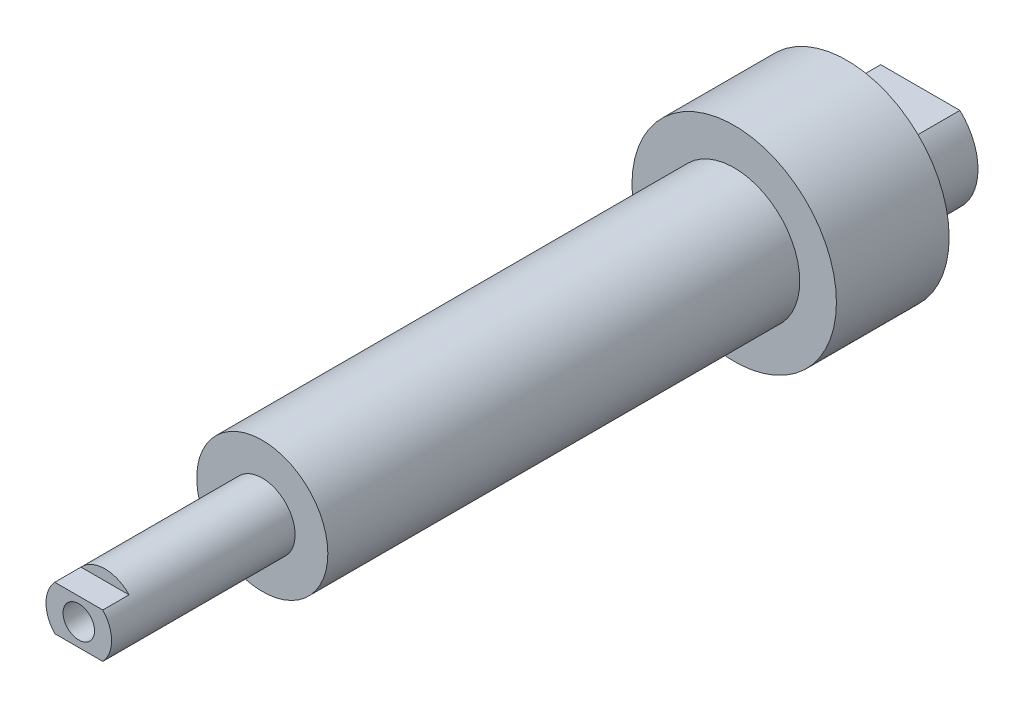
ISO-10303-21;
HEADER;
FILE_DESCRIPTION(('STEP AP214'),'2;1');
FILE_NAME('part.step','',(''),(''),'','','');
FILE_SCHEMA(('AUTOMOTIVE_DESIGN { 1 0 10303 214 1 1 1 1 }'));
ENDSEC;
DATA;
#1=APPLICATION_CONTEXT('core data for automotive mechanical design processes');
#2=APPLICATION_PROTOCOL_DEFINITION('international standard','automotive_design',2000,#1);
#3=PRODUCT_CONTEXT('',#1,'mechanical');
#4=PRODUCT('Part','Part','',(#3));
#5=PRODUCT_RELATED_PRODUCT_CATEGORY('part','',(#4));
#6=PRODUCT_DEFINITION_FORMATION('','',#4);
#7=PRODUCT_DEFINITION_CONTEXT('part definition',#1,'design');
#8=PRODUCT_DEFINITION('design','',#6,#7);
#9=PRODUCT_DEFINITION_SHAPE('','',#8);
#10=(LENGTH_UNIT() NAMED_UNIT(*) SI_UNIT(.MILLI.,.METRE.));
#11=(NAMED_UNIT(*) PLANE_ANGLE_UNIT() SI_UNIT($,.RADIAN.));
#12=(NAMED_UNIT(*) SI_UNIT($,.STERADIAN.) SOLID_ANGLE_UNIT());
#13=UNCERTAINTY_MEASURE_WITH_UNIT(LENGTH_MEASURE(1.E-05),#10,'distance_accuracy_value','');
#14=(GEOMETRIC_REPRESENTATION_CONTEXT(3) GLOBAL_UNCERTAINTY_ASSIGNED_CONTEXT((#13)) GLOBAL_UNIT_ASSIGNED_CONTEXT((#10,
#11,#12)) REPRESENTATION_CONTEXT('',''));
#15=CARTESIAN_POINT('',(0.,0.,0.));
#16=DIRECTION('',(0.,0.,1.));
#17=DIRECTION('',(1.,0.,0.));
#18=AXIS2_PLACEMENT_3D('',#15,#16,#17);
#19=CARTESIAN_POINT('',(0.,0.,251.));
#20=DIRECTION('',(0.,0.,1.));
#21=DIRECTION('',(1.,0.,0.));
#22=AXIS2_PLACEMENT_3D('',#19,#20,#21);
#23=CYLINDRICAL_SURFACE('',#22,12.5);
#24=DIRECTION('',(0.,0.,-1.));
#25=VECTOR('',#24,1.);
#26=CARTESIAN_POINT('',(-9.16515138991168,-8.5,832.780641203438));
#27=LINE('',#26,#25);
#28=CARTESIAN_POINT('',(-9.16515138991168,-8.5,321.));
#29=VERTEX_POINT('',#28);
#30=CARTESIAN_POINT('',(-9.16515138991168,-8.5,311.));
#31=VERTEX_POINT('',#30);
#32=EDGE_CURVE('E121',#29,#31,#27,.T.);
#33=ORIENTED_EDGE('',*,*,#32,.F.);
#34=CARTESIAN_POINT('',(0.,0.,321.));
#35=DIRECTION('',(0.,0.,1.));
#36=DIRECTION('',(1.,0.,0.));
#37=AXIS2_PLACEMENT_3D('',#34,#35,#36);
#38=CIRCLE('',#37,12.5);
#39=CARTESIAN_POINT('',(-9.16515138991168,8.5,321.));
#40=VERTEX_POINT('',#39);
#41=EDGE_CURVE('E110',#40,#29,#38,.T.);
#42=ORIENTED_EDGE('',*,*,#41,.F.);
#43=DIRECTION('',(0.,0.,-1.));
#44=VECTOR('',#43,1.);
#45=CARTESIAN_POINT('',(-9.16515138991168,8.5,1057.78064120344));
#46=LINE('',#45,#44);
#47=CARTESIAN_POINT('',(-9.16515138991168,8.5,311.));
#48=VERTEX_POINT('',#47);
#49=EDGE_CURVE('E139',#40,#48,#46,.T.);
#50=ORIENTED_EDGE('',*,*,#49,.T.);
#51=CARTESIAN_POINT('',(0.,0.,311.));
#52=DIRECTION('',(0.,0.,1.));
#53=DIRECTION('',(1.,0.,0.));
#54=AXIS2_PLACEMENT_3D('',#51,#52,#53);
#55=CIRCLE('',#54,12.5);
#56=CARTESIAN_POINT('',(9.16515138991168,8.5,311.));
#57=VERTEX_POINT('',#56);
#58=EDGE_CURVE('E127',#57,#48,#55,.T.);
#59=ORIENTED_EDGE('',*,*,#58,.F.);
#60=DIRECTION('',(0.,0.,-1.));
#61=VECTOR('',#60,1.);
#62=CARTESIAN_POINT('',(9.16515138991168,8.5,1057.78064120344));
#63=LINE('',#62,#61);
#64=CARTESIAN_POINT('',(9.16515138991168,8.5,321.));
#65=VERTEX_POINT('',#64);
#66=EDGE_CURVE('E136',#65,#57,#63,.T.);
#67=ORIENTED_EDGE('',*,*,#66,.F.);
#68=CARTESIAN_POINT('',(9.16515138991168,-8.5,321.));
#69=VERTEX_POINT('',#68);
#70=EDGE_CURVE('E118',#69,#65,#38,.T.);
#71=ORIENTED_EDGE('',*,*,#70,.F.);
#72=DIRECTION('',(0.,0.,-1.));
#73=VECTOR('',#72,1.);
#74=CARTESIAN_POINT('',(9.16515138991168,-8.5,832.780641203438));
#75=LINE('',#74,#73);
#76=CARTESIAN_POINT('',(9.16515138991168,-8.5,311.));
#77=VERTEX_POINT('',#76);
#78=EDGE_CURVE('E65',#69,#77,#75,.T.);
#79=ORIENTED_EDGE('',*,*,#78,.T.);
#80=CARTESIAN_POINT('',(0.,0.,311.));
#81=DIRECTION('',(0.,0.,1.));
#82=DIRECTION('',(1.,0.,0.));
#83=AXIS2_PLACEMENT_3D('',#80,#81,#82);
#84=CIRCLE('',#83,12.5);
#85=EDGE_CURVE('E60',#31,#77,#84,.T.);
#86=ORIENTED_EDGE('',*,*,#85,.F.);
#87=EDGE_LOOP('',(#33,#42,#50,#59,#67,#71,#79,#86));
#88=FACE_BOUND('',#87,.T.);
#89=CARTESIAN_POINT('',(0.,0.,251.));
#90=DIRECTION('',(0.,0.,1.));
#91=DIRECTION('',(1.,0.,0.));
#92=AXIS2_PLACEMENT_3D('',#89,#90,#91);
#93=CIRCLE('',#92,12.5);
#94=CARTESIAN_POINT('',(12.5,0.,251.));
#95=VERTEX_POINT('',#94);
#96=EDGE_CURVE('E117',#95,#95,#93,.T.);
#97=ORIENTED_EDGE('',*,*,#96,.T.);
#98=EDGE_LOOP('',(#97));
#99=FACE_BOUND('',#98,.T.);
#100=ADVANCED_FACE('F43',(#88,#99),#23,.T.);
#101=CARTESIAN_POINT('',(0.,0.,321.));
#102=DIRECTION('',(0.,0.,1.));
#103=DIRECTION('',(1.,0.,0.));
#104=AXIS2_PLACEMENT_3D('',#101,#102,#103);
#105=PLANE('',#104);
#106=CARTESIAN_POINT('',(0.,0.,321.));
#107=DIRECTION('',(0.,0.,1.));
#108=DIRECTION('',(1.,0.,0.));
#109=AXIS2_PLACEMENT_3D('',#106,#107,#108);
#110=CIRCLE('',#109,6.);
#111=CARTESIAN_POINT('',(6.,0.,321.));
#112=VERTEX_POINT('',#111);
#113=EDGE_CURVE('E449',#112,#112,#110,.T.);
#114=ORIENTED_EDGE('',*,*,#113,.F.);
#115=EDGE_LOOP('',(#114));
#116=FACE_BOUND('',#115,.T.);
#117=DIRECTION('',(1.,0.,0.));
#118=VECTOR('',#117,1.);
#119=CARTESIAN_POINT('',(-9.16515138991168,-8.5,321.));
#120=LINE('',#119,#118);
#121=EDGE_CURVE('E113',#29,#69,#120,.T.);
#122=ORIENTED_EDGE('',*,*,#121,.T.);
#123=ORIENTED_EDGE('',*,*,#70,.T.);
#124=DIRECTION('',(1.,0.,0.));
#125=VECTOR('',#124,1.);
#126=CARTESIAN_POINT('',(-9.16515138991168,8.5,321.));
#127=LINE('',#126,#125);
#128=EDGE_CURVE('E115',#40,#65,#127,.T.);
#129=ORIENTED_EDGE('',*,*,#128,.F.);
#130=ORIENTED_EDGE('',*,*,#41,.T.);
#131=EDGE_LOOP('',(#122,#123,#129,#130));
#132=FACE_BOUND('',#131,.T.);
#133=ADVANCED_FACE('F111',(#116,#132),#105,.T.);
#134=CARTESIAN_POINT('',(0.,0.,71.));
#135=DIRECTION('',(0.,0.,1.));
#136=DIRECTION('',(1.,0.,0.));
#137=AXIS2_PLACEMENT_3D('',#134,#135,#136);
#138=CYLINDRICAL_SURFACE('',#137,25.);
#139=CARTESIAN_POINT('',(0.,0.,71.));
#140=DIRECTION('',(0.,0.,1.));
#141=DIRECTION('',(1.,0.,0.));
#142=AXIS2_PLACEMENT_3D('',#139,#140,#141);
#143=CIRCLE('',#142,25.);
#144=CARTESIAN_POINT('',(25.,0.,71.));
#145=VERTEX_POINT('',#144);
#146=EDGE_CURVE('E52',#145,#145,#143,.T.);
#147=ORIENTED_EDGE('',*,*,#146,.T.);
#148=EDGE_LOOP('',(#147));
#149=FACE_BOUND('',#148,.T.);
#150=CARTESIAN_POINT('',(0.,0.,251.));
#151=DIRECTION('',(0.,0.,1.));
#152=DIRECTION('',(1.,0.,0.));
#153=AXIS2_PLACEMENT_3D('',#150,#151,#152);
#154=CIRCLE('',#153,25.);
#155=CARTESIAN_POINT('',(25.,0.,251.));
#156=VERTEX_POINT('',#155);
#157=EDGE_CURVE('E143',#156,#156,#154,.F.);
#158=ORIENTED_EDGE('',*,*,#157,.T.);
#159=EDGE_LOOP('',(#158));
#160=FACE_BOUND('',#159,.T.);
#161=ADVANCED_FACE('F190',(#149,#160),#138,.T.);
#162=CARTESIAN_POINT('',(0.,0.,28.));
#163=DIRECTION('',(0.,0.,-1.));
#164=DIRECTION('',(-1.,0.,0.));
#165=AXIS2_PLACEMENT_3D('',#162,#163,#164);
#166=CYLINDRICAL_SURFACE('',#165,22.);
#167=DIRECTION('',(0.,0.,1.));
#168=VECTOR('',#167,1.);
#169=CARTESIAN_POINT('',(-15.0996688705415,16.,-459.280641203437));
#170=LINE('',#169,#168);
#171=CARTESIAN_POINT('',(-15.0996688705415,16.,0.));
#172=VERTEX_POINT('',#171);
#173=CARTESIAN_POINT('',(-15.0996688705415,16.,25.));
#174=VERTEX_POINT('',#173);
#175=EDGE_CURVE('E153',#172,#174,#170,.T.);
#176=ORIENTED_EDGE('',*,*,#175,.F.);
#177=CARTESIAN_POINT('',(0.,0.,0.));
#178=DIRECTION('',(0.,0.,-1.));
#179=DIRECTION('',(-1.,0.,0.));
#180=AXIS2_PLACEMENT_3D('',#177,#178,#179);
#181=CIRCLE('',#180,22.);
#182=CARTESIAN_POINT('',(-15.0996688705415,-16.,0.));
#183=VERTEX_POINT('',#182);
#184=EDGE_CURVE('E181',#183,#172,#181,.T.);
#185=ORIENTED_EDGE('',*,*,#184,.F.);
#186=DIRECTION('',(0.,0.,1.));
#187=VECTOR('',#186,1.);
#188=CARTESIAN_POINT('',(-15.0996688705415,-16.,-513.030641203437));
#189=LINE('',#188,#187);
#190=CARTESIAN_POINT('',(-15.0996688705415,-16.,25.));
#191=VERTEX_POINT('',#190);
#192=EDGE_CURVE('E166',#183,#191,#189,.T.);
#193=ORIENTED_EDGE('',*,*,#192,.T.);
#194=CARTESIAN_POINT('',(0.,0.,25.));
#195=DIRECTION('',(0.,0.,-1.));
#196=DIRECTION('',(-1.,0.,0.));
#197=AXIS2_PLACEMENT_3D('',#194,#195,#196);
#198=CIRCLE('',#197,22.);
#199=CARTESIAN_POINT('',(15.0996688705415,-16.,25.));
#200=VERTEX_POINT('',#199);
#201=EDGE_CURVE('E156',#200,#191,#198,.T.);
#202=ORIENTED_EDGE('',*,*,#201,.F.);
#203=DIRECTION('',(0.,0.,1.));
#204=VECTOR('',#203,1.);
#205=CARTESIAN_POINT('',(15.0996688705415,-16.,-513.030641203437));
#206=LINE('',#205,#204);
#207=CARTESIAN_POINT('',(15.0996688705415,-16.,0.));
#208=VERTEX_POINT('',#207);
#209=EDGE_CURVE('E161',#208,#200,#206,.T.);
#210=ORIENTED_EDGE('',*,*,#209,.F.);
#211=CARTESIAN_POINT('',(15.0996688705415,16.,0.));
#212=VERTEX_POINT('',#211);
#213=EDGE_CURVE('E174',#212,#208,#181,.T.);
#214=ORIENTED_EDGE('',*,*,#213,.F.);
#215=DIRECTION('',(0.,0.,1.));
#216=VECTOR('',#215,1.);
#217=CARTESIAN_POINT('',(15.0996688705415,16.,-459.280641203437));
#218=LINE('',#217,#216);
#219=CARTESIAN_POINT('',(15.0996688705415,16.,25.));
#220=VERTEX_POINT('',#219);
#221=EDGE_CURVE('E147',#212,#220,#218,.T.);
#222=ORIENTED_EDGE('',*,*,#221,.T.);
#223=CARTESIAN_POINT('',(0.,0.,25.));
#224=DIRECTION('',(0.,0.,-1.));
#225=DIRECTION('',(-1.,0.,0.));
#226=AXIS2_PLACEMENT_3D('',#223,#224,#225);
#227=CIRCLE('',#226,22.);
#228=EDGE_CURVE('E150',#174,#220,#227,.T.);
#229=ORIENTED_EDGE('',*,*,#228,.F.);
#230=EDGE_LOOP('',(#176,#185,#193,#202,#210,#214,#222,#229));
#231=FACE_BOUND('',#230,.T.);
#232=CARTESIAN_POINT('',(0.,0.,28.));
#233=DIRECTION('',(0.,0.,-1.));
#234=DIRECTION('',(-1.,0.,0.));
#235=AXIS2_PLACEMENT_3D('',#232,#233,#234);
#236=CIRCLE('',#235,22.);
#237=CARTESIAN_POINT('',(-22.,0.,28.));
#238=VERTEX_POINT('',#237);
#239=EDGE_CURVE('E177',#238,#238,#236,.T.);
#240=ORIENTED_EDGE('',*,*,#239,.T.);
#241=EDGE_LOOP('',(#240));
#242=FACE_BOUND('',#241,.T.);
#243=ADVANCED_FACE('F234',(#231,#242),#166,.T.);
#244=CARTESIAN_POINT('',(0.,0.,0.));
#245=DIRECTION('',(0.,0.,1.));
#246=DIRECTION('',(1.,0.,0.));
#247=AXIS2_PLACEMENT_3D('',#244,#245,#246);
#248=PLANE('',#247);
#249=CARTESIAN_POINT('',(0.,0.,0.));
#250=DIRECTION('',(0.,0.,-1.));
#251=DIRECTION('',(-1.,0.,0.));
#252=AXIS2_PLACEMENT_3D('',#249,#250,#251);
#253=CIRCLE('',#252,13.);
#254=CARTESIAN_POINT('',(-13.,0.,0.));
#255=VERTEX_POINT('',#254);
#256=EDGE_CURVE('E168',#255,#255,#253,.T.);
#257=ORIENTED_EDGE('',*,*,#256,.F.);
#258=EDGE_LOOP('',(#257));
#259=FACE_BOUND('',#258,.T.);
#260=ORIENTED_EDGE('',*,*,#184,.T.);
#261=DIRECTION('',(-1.,0.,0.));
#262=VECTOR('',#261,1.);
#263=CARTESIAN_POINT('',(-15.0996688705415,16.,0.));
#264=LINE('',#263,#262);
#265=EDGE_CURVE('E148',#212,#172,#264,.T.);
#266=ORIENTED_EDGE('',*,*,#265,.F.);
#267=ORIENTED_EDGE('',*,*,#213,.T.);
#268=DIRECTION('',(-1.,0.,0.));
#269=VECTOR('',#268,1.);
#270=CARTESIAN_POINT('',(-15.0996688705415,-16.,0.));
#271=LINE('',#270,#269);
#272=EDGE_CURVE('E162',#208,#183,#271,.T.);
#273=ORIENTED_EDGE('',*,*,#272,.T.);
#274=EDGE_LOOP('',(#260,#266,#267,#273));
#275=FACE_BOUND('',#274,.T.);
#276=ADVANCED_FACE('F237',(#259,#275),#248,.F.);
#277=CARTESIAN_POINT('',(0.,0.,321.));
#278=DIRECTION('',(0.,0.,-1.));
#279=DIRECTION('',(-1.,0.,0.));
#280=AXIS2_PLACEMENT_3D('',#277,#278,#279);
#281=CYLINDRICAL_SURFACE('',#280,39.);
#282=CARTESIAN_POINT('',(0.,0.,71.));
#283=DIRECTION('',(0.,0.,1.));
#284=DIRECTION('',(1.,0.,0.));
#285=AXIS2_PLACEMENT_3D('',#282,#283,#284);
#286=CIRCLE('',#285,39.);
#287=CARTESIAN_POINT('',(39.,0.,71.));
#288=VERTEX_POINT('',#287);
#289=EDGE_CURVE('E12',#288,#288,#286,.T.);
#290=ORIENTED_EDGE('',*,*,#289,.F.);
#291=EDGE_LOOP('',(#290));
#292=FACE_BOUND('',#291,.T.);
#293=CARTESIAN_POINT('',(0.,0.,28.));
#294=DIRECTION('',(0.,0.,-1.));
#295=DIRECTION('',(-1.,0.,0.));
#296=AXIS2_PLACEMENT_3D('',#293,#294,#295);
#297=CIRCLE('',#296,39.);
#298=CARTESIAN_POINT('',(-39.,0.,28.));
#299=VERTEX_POINT('',#298);
#300=EDGE_CURVE('E180',#299,#299,#297,.T.);
#301=ORIENTED_EDGE('',*,*,#300,.F.);
#302=EDGE_LOOP('',(#301));
#303=FACE_BOUND('',#302,.T.);
#304=ADVANCED_FACE('F45',(#292,#303),#281,.T.);
#305=CARTESIAN_POINT('',(0.,0.,71.));
#306=DIRECTION('',(0.,0.,1.));
#307=DIRECTION('',(1.,0.,0.));
#308=AXIS2_PLACEMENT_3D('',#305,#306,#307);
#309=PLANE('',#308);
#310=ORIENTED_EDGE('',*,*,#146,.F.);
#311=EDGE_LOOP('',(#310));
#312=FACE_BOUND('',#311,.T.);
#313=ORIENTED_EDGE('',*,*,#289,.T.);
#314=EDGE_LOOP('',(#313));
#315=FACE_BOUND('',#314,.T.);
#316=ADVANCED_FACE('F241',(#312,#315),#309,.T.);
#317=CARTESIAN_POINT('',(0.,0.,28.));
#318=DIRECTION('',(0.,0.,-1.));
#319=DIRECTION('',(-1.,0.,0.));
#320=AXIS2_PLACEMENT_3D('',#317,#318,#319);
#321=PLANE('',#320);
#322=ORIENTED_EDGE('',*,*,#239,.F.);
#323=EDGE_LOOP('',(#322));
#324=FACE_BOUND('',#323,.T.);
#325=ORIENTED_EDGE('',*,*,#300,.T.);
#326=EDGE_LOOP('',(#325));
#327=FACE_BOUND('',#326,.T.);
#328=ADVANCED_FACE('F232',(#324,#327),#321,.T.);
#329=CARTESIAN_POINT('',(0.,0.,91.));
#330=DIRECTION('',(0.,0.,-1.));
#331=DIRECTION('',(-1.,0.,0.));
#332=AXIS2_PLACEMENT_3D('',#329,#330,#331);
#333=CYLINDRICAL_SURFACE('',#332,13.);
#334=CARTESIAN_POINT('',(0.,0.,91.));
#335=DIRECTION('',(0.,0.,-1.));
#336=DIRECTION('',(-1.,0.,0.));
#337=AXIS2_PLACEMENT_3D('',#334,#335,#336);
#338=CIRCLE('',#337,13.);
#339=CARTESIAN_POINT('',(-13.,0.,91.));
#340=VERTEX_POINT('',#339);
#341=EDGE_CURVE('E171',#340,#340,#338,.T.);
#342=ORIENTED_EDGE('',*,*,#341,.F.);
#343=EDGE_LOOP('',(#342));
#344=FACE_BOUND('',#343,.T.);
#345=ORIENTED_EDGE('',*,*,#256,.T.);
#346=EDGE_LOOP('',(#345));
#347=FACE_BOUND('',#346,.T.);
#348=ADVANCED_FACE('F228',(#344,#347),#333,.F.);
#349=CARTESIAN_POINT('',(0.,0.,91.));
#350=DIRECTION('',(0.,0.,-1.));
#351=DIRECTION('',(-1.,0.,0.));
#352=AXIS2_PLACEMENT_3D('',#349,#350,#351);
#353=PLANE('',#352);
#354=CARTESIAN_POINT('',(0.,0.,91.));
#355=DIRECTION('',(0.,0.,-1.));
#356=DIRECTION('',(-1.,0.,0.));
#357=AXIS2_PLACEMENT_3D('',#354,#355,#356);
#358=CIRCLE('',#357,6.);
#359=CARTESIAN_POINT('',(-6.,0.,91.));
#360=VERTEX_POINT('',#359);
#361=EDGE_CURVE('E47',#360,#360,#358,.T.);
#362=ORIENTED_EDGE('',*,*,#361,.F.);
#363=EDGE_LOOP('',(#362));
#364=FACE_BOUND('',#363,.T.);
#365=ORIENTED_EDGE('',*,*,#341,.T.);
#366=EDGE_LOOP('',(#365));
#367=FACE_BOUND('',#366,.T.);
#368=ADVANCED_FACE('F221',(#364,#367),#353,.T.);
#369=CARTESIAN_POINT('',(-15.0996688705415,-16.,-513.030641203437));
#370=DIRECTION('',(0.,-1.,0.));
#371=DIRECTION('',(0.,0.,-1.));
#372=AXIS2_PLACEMENT_3D('',#369,#370,#371);
#373=PLANE('',#372);
#374=ORIENTED_EDGE('',*,*,#272,.F.);
#375=ORIENTED_EDGE('',*,*,#209,.T.);
#376=DIRECTION('',(-1.,0.,0.));
#377=VECTOR('',#376,1.);
#378=CARTESIAN_POINT('',(-15.0996688705415,-16.,25.));
#379=LINE('',#378,#377);
#380=EDGE_CURVE('E158',#200,#191,#379,.T.);
#381=ORIENTED_EDGE('',*,*,#380,.T.);
#382=ORIENTED_EDGE('',*,*,#192,.F.);
#383=EDGE_LOOP('',(#374,#375,#381,#382));
#384=FACE_BOUND('',#383,.T.);
#385=ADVANCED_FACE('F218',(#384),#373,.T.);
#386=CARTESIAN_POINT('',(0.,0.,25.));
#387=DIRECTION('',(0.,0.,1.));
#388=DIRECTION('',(1.,0.,0.));
#389=AXIS2_PLACEMENT_3D('',#386,#387,#388);
#390=PLANE('',#389);
#391=ORIENTED_EDGE('',*,*,#201,.T.);
#392=ORIENTED_EDGE('',*,*,#380,.F.);
#393=EDGE_LOOP('',(#391,#392));
#394=FACE_BOUND('',#393,.T.);
#395=ADVANCED_FACE('F213',(#394),#390,.F.);
#396=CARTESIAN_POINT('',(-15.0996688705415,16.,-459.280641203437));
#397=DIRECTION('',(0.,-1.,0.));
#398=DIRECTION('',(0.,0.,-1.));
#399=AXIS2_PLACEMENT_3D('',#396,#397,#398);
#400=PLANE('',#399);
#401=ORIENTED_EDGE('',*,*,#265,.T.);
#402=ORIENTED_EDGE('',*,*,#175,.T.);
#403=DIRECTION('',(-1.,0.,0.));
#404=VECTOR('',#403,1.);
#405=CARTESIAN_POINT('',(-15.0996688705415,16.,25.));
#406=LINE('',#405,#404);
#407=EDGE_CURVE('E145',#220,#174,#406,.T.);
#408=ORIENTED_EDGE('',*,*,#407,.F.);
#409=ORIENTED_EDGE('',*,*,#221,.F.);
#410=EDGE_LOOP('',(#401,#402,#408,#409));
#411=FACE_BOUND('',#410,.T.);
#412=ADVANCED_FACE('F210',(#411),#400,.F.);
#413=CARTESIAN_POINT('',(0.,0.,25.));
#414=DIRECTION('',(0.,0.,1.));
#415=DIRECTION('',(1.,0.,0.));
#416=AXIS2_PLACEMENT_3D('',#413,#414,#415);
#417=PLANE('',#416);
#418=ORIENTED_EDGE('',*,*,#407,.T.);
#419=ORIENTED_EDGE('',*,*,#228,.T.);
#420=EDGE_LOOP('',(#418,#419));
#421=FACE_BOUND('',#420,.T.);
#422=ADVANCED_FACE('F196',(#421),#417,.F.);
#423=CARTESIAN_POINT('',(0.,0.,251.));
#424=DIRECTION('',(0.,0.,1.));
#425=DIRECTION('',(1.,0.,0.));
#426=AXIS2_PLACEMENT_3D('',#423,#424,#425);
#427=PLANE('',#426);
#428=ORIENTED_EDGE('',*,*,#157,.F.);
#429=EDGE_LOOP('',(#428));
#430=FACE_BOUND('',#429,.T.);
#431=ORIENTED_EDGE('',*,*,#96,.F.);
#432=EDGE_LOOP('',(#431));
#433=FACE_BOUND('',#432,.T.);
#434=ADVANCED_FACE('F192',(#430,#433),#427,.T.);
#435=CARTESIAN_POINT('',(-9.16515138991168,8.5,1057.78064120344));
#436=DIRECTION('',(0.,1.,0.));
#437=DIRECTION('',(0.,0.,1.));
#438=AXIS2_PLACEMENT_3D('',#435,#436,#437);
#439=PLANE('',#438);
#440=ORIENTED_EDGE('',*,*,#49,.F.);
#441=ORIENTED_EDGE('',*,*,#128,.T.);
#442=ORIENTED_EDGE('',*,*,#66,.T.);
#443=DIRECTION('',(1.,0.,0.));
#444=VECTOR('',#443,1.);
#445=CARTESIAN_POINT('',(-9.16515138991168,8.5,311.));
#446=LINE('',#445,#444);
#447=EDGE_CURVE('E129',#48,#57,#446,.T.);
#448=ORIENTED_EDGE('',*,*,#447,.F.);
#449=EDGE_LOOP('',(#440,#441,#442,#448));
#450=FACE_BOUND('',#449,.T.);
#451=ADVANCED_FACE('F195',(#450),#439,.T.);
#452=CARTESIAN_POINT('',(0.,0.,311.));
#453=DIRECTION('',(0.,0.,1.));
#454=DIRECTION('',(1.,0.,0.));
#455=AXIS2_PLACEMENT_3D('',#452,#453,#454);
#456=PLANE('',#455);
#457=ORIENTED_EDGE('',*,*,#447,.T.);
#458=ORIENTED_EDGE('',*,*,#58,.T.);
#459=EDGE_LOOP('',(#457,#458));
#460=FACE_BOUND('',#459,.T.);
#461=ADVANCED_FACE('F207',(#460),#456,.T.);
#462=CARTESIAN_POINT('',(-9.16515138991168,-8.5,832.780641203438));
#463=DIRECTION('',(0.,1.,0.));
#464=DIRECTION('',(0.,0.,1.));
#465=AXIS2_PLACEMENT_3D('',#462,#463,#464);
#466=PLANE('',#465);
#467=ORIENTED_EDGE('',*,*,#32,.T.);
#468=DIRECTION('',(1.,0.,0.));
#469=VECTOR('',#468,1.);
#470=CARTESIAN_POINT('',(-9.16515138991168,-8.5,311.));
#471=LINE('',#470,#469);
#472=EDGE_CURVE('E134',#31,#77,#471,.T.);
#473=ORIENTED_EDGE('',*,*,#472,.T.);
#474=ORIENTED_EDGE('',*,*,#78,.F.);
#475=ORIENTED_EDGE('',*,*,#121,.F.);
#476=EDGE_LOOP('',(#467,#473,#474,#475));
#477=FACE_BOUND('',#476,.T.);
#478=ADVANCED_FACE('F126',(#477),#466,.F.);
#479=CARTESIAN_POINT('',(0.,0.,311.));
#480=DIRECTION('',(0.,0.,1.));
#481=DIRECTION('',(1.,0.,0.));
#482=AXIS2_PLACEMENT_3D('',#479,#480,#481);
#483=PLANE('',#482);
#484=ORIENTED_EDGE('',*,*,#85,.T.);
#485=ORIENTED_EDGE('',*,*,#472,.F.);
#486=EDGE_LOOP('',(#484,#485));
#487=FACE_BOUND('',#486,.T.);
#488=ADVANCED_FACE('F330',(#487),#483,.T.);
#489=CARTESIAN_POINT('',(0.,0.,0.));
#490=DIRECTION('',(0.,0.,1.));
#491=DIRECTION('',(1.,0.,0.));
#492=AXIS2_PLACEMENT_3D('',#489,#490,#491);
#493=CYLINDRICAL_SURFACE('',#492,6.);
#494=ORIENTED_EDGE('',*,*,#361,.T.);
#495=EDGE_LOOP('',(#494));
#496=FACE_BOUND('',#495,.T.);
#497=ORIENTED_EDGE('',*,*,#113,.T.);
#498=EDGE_LOOP('',(#497));
#499=FACE_BOUND('',#498,.T.);
#500=ADVANCED_FACE('F337',(#496,#499),#493,.F.);
#501=CLOSED_SHELL('',(#100,#133,#161,#243,#276,#304,#316,#328,#348,#368,#385,#395,#412,#422,
#434,#451,#461,#478,#488,#500));
#502=MANIFOLD_SOLID_BREP('B2',#501);
#503=ADVANCED_BREP_SHAPE_REPRESENTATION('',(#18,#502),#14);
#504=SHAPE_DEFINITION_REPRESENTATION(#9,#503);
ENDSEC;
END-ISO-10303-21;
